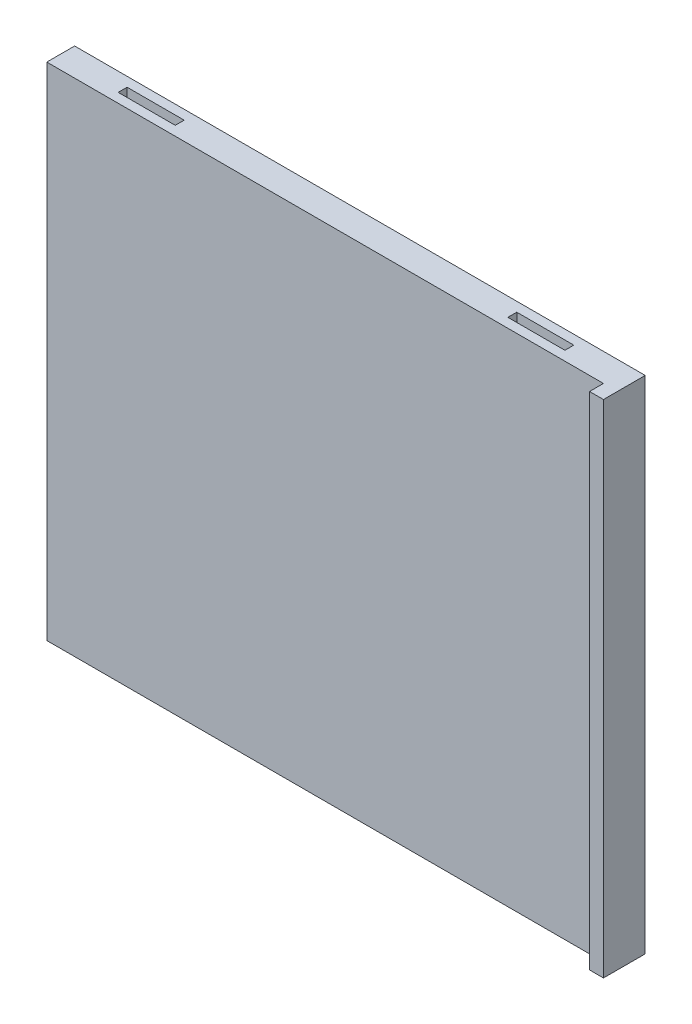
ISO-10303-21;
HEADER;
FILE_DESCRIPTION(('STEP AP214'),'2;1');
FILE_NAME('part.step','',(''),(''),'','','');
FILE_SCHEMA(('AUTOMOTIVE_DESIGN { 1 0 10303 214 1 1 1 1 }'));
ENDSEC;
DATA;
#1=APPLICATION_CONTEXT('core data for automotive mechanical design processes');
#2=APPLICATION_PROTOCOL_DEFINITION('international standard','automotive_design',2000,#1);
#3=PRODUCT_CONTEXT('',#1,'mechanical');
#4=PRODUCT('Part','Part','',(#3));
#5=PRODUCT_RELATED_PRODUCT_CATEGORY('part','',(#4));
#6=PRODUCT_DEFINITION_FORMATION('','',#4);
#7=PRODUCT_DEFINITION_CONTEXT('part definition',#1,'design');
#8=PRODUCT_DEFINITION('design','',#6,#7);
#9=PRODUCT_DEFINITION_SHAPE('','',#8);
#10=(LENGTH_UNIT() NAMED_UNIT(*) SI_UNIT(.MILLI.,.METRE.));
#11=(NAMED_UNIT(*) PLANE_ANGLE_UNIT() SI_UNIT($,.RADIAN.));
#12=(NAMED_UNIT(*) SI_UNIT($,.STERADIAN.) SOLID_ANGLE_UNIT());
#13=UNCERTAINTY_MEASURE_WITH_UNIT(LENGTH_MEASURE(1.E-05),#10,'distance_accuracy_value','');
#14=(GEOMETRIC_REPRESENTATION_CONTEXT(3) GLOBAL_UNCERTAINTY_ASSIGNED_CONTEXT((#13)) GLOBAL_UNIT_ASSIGNED_CONTEXT((#10,
#11,#12)) REPRESENTATION_CONTEXT('',''));
#15=CARTESIAN_POINT('',(0.,0.,0.));
#16=DIRECTION('',(0.,0.,1.));
#17=DIRECTION('',(1.,0.,0.));
#18=AXIS2_PLACEMENT_3D('',#15,#16,#17);
#19=CARTESIAN_POINT('',(102.5,90.,10.));
#20=DIRECTION('',(0.,-1.,0.));
#21=DIRECTION('',(0.,0.,-1.));
#22=AXIS2_PLACEMENT_3D('',#19,#20,#21);
#23=PLANE('',#22);
#24=DIRECTION('',(0.,0.,1.));
#25=VECTOR('',#24,1.);
#26=CARTESIAN_POINT('',(-59.75,90.,3.4));
#27=LINE('',#26,#25);
#28=CARTESIAN_POINT('',(-59.75,90.,3.4));
#29=VERTEX_POINT('',#28);
#30=CARTESIAN_POINT('',(-59.75,90.,6.6));
#31=VERTEX_POINT('',#30);
#32=EDGE_CURVE('E62',#29,#31,#27,.T.);
#33=ORIENTED_EDGE('',*,*,#32,.T.);
#34=DIRECTION('',(-1.,0.,0.));
#35=VECTOR('',#34,1.);
#36=CARTESIAN_POINT('',(-59.75,90.,6.6));
#37=LINE('',#36,#35);
#38=CARTESIAN_POINT('',(-80.25,90.,6.6));
#39=VERTEX_POINT('',#38);
#40=EDGE_CURVE('E281',#31,#39,#37,.T.);
#41=ORIENTED_EDGE('',*,*,#40,.T.);
#42=DIRECTION('',(0.,0.,-1.));
#43=VECTOR('',#42,1.);
#44=CARTESIAN_POINT('',(-80.25,90.,3.4));
#45=LINE('',#44,#43);
#46=CARTESIAN_POINT('',(-80.25,90.,3.4));
#47=VERTEX_POINT('',#46);
#48=EDGE_CURVE('E292',#39,#47,#45,.T.);
#49=ORIENTED_EDGE('',*,*,#48,.T.);
#50=DIRECTION('',(1.,0.,0.));
#51=VECTOR('',#50,1.);
#52=CARTESIAN_POINT('',(-59.75,90.,3.4));
#53=LINE('',#52,#51);
#54=EDGE_CURVE('E288',#47,#29,#53,.T.);
#55=ORIENTED_EDGE('',*,*,#54,.T.);
#56=EDGE_LOOP('',(#33,#41,#49,#55));
#57=FACE_BOUND('',#56,.T.);
#58=DIRECTION('',(-1.,0.,0.));
#59=VECTOR('',#58,1.);
#60=CARTESIAN_POINT('',(102.5,90.,0.));
#61=LINE('',#60,#59);
#62=CARTESIAN_POINT('',(102.5,90.,0.));
#63=VERTEX_POINT('',#62);
#64=CARTESIAN_POINT('',(-102.5,90.,0.));
#65=VERTEX_POINT('',#64);
#66=EDGE_CURVE('E448',#63,#65,#61,.T.);
#67=ORIENTED_EDGE('',*,*,#66,.T.);
#68=DIRECTION('',(0.,0.,-1.));
#69=VECTOR('',#68,1.);
#70=CARTESIAN_POINT('',(-102.5,90.,10.));
#71=LINE('',#70,#69);
#72=CARTESIAN_POINT('',(-102.5,90.,10.));
#73=VERTEX_POINT('',#72);
#74=EDGE_CURVE('E11',#73,#65,#71,.T.);
#75=ORIENTED_EDGE('',*,*,#74,.F.);
#76=DIRECTION('',(-1.,0.,0.));
#77=VECTOR('',#76,1.);
#78=CARTESIAN_POINT('',(102.5,90.,10.));
#79=LINE('',#78,#77);
#80=CARTESIAN_POINT('',(97.5,90.,10.));
#81=VERTEX_POINT('',#80);
#82=EDGE_CURVE('E452',#81,#73,#79,.T.);
#83=ORIENTED_EDGE('',*,*,#82,.F.);
#84=DIRECTION('',(0.,0.,-1.));
#85=VECTOR('',#84,1.);
#86=CARTESIAN_POINT('',(97.5,90.,15.));
#87=LINE('',#86,#85);
#88=CARTESIAN_POINT('',(97.5,90.,15.));
#89=VERTEX_POINT('',#88);
#90=EDGE_CURVE('E450',#89,#81,#87,.T.);
#91=ORIENTED_EDGE('',*,*,#90,.F.);
#92=DIRECTION('',(-1.,0.,0.));
#93=VECTOR('',#92,1.);
#94=CARTESIAN_POINT('',(97.5,90.,15.));
#95=LINE('',#94,#93);
#96=CARTESIAN_POINT('',(102.5,90.,15.));
#97=VERTEX_POINT('',#96);
#98=EDGE_CURVE('E431',#97,#89,#95,.T.);
#99=ORIENTED_EDGE('',*,*,#98,.F.);
#100=DIRECTION('',(0.,0.,-1.));
#101=VECTOR('',#100,1.);
#102=CARTESIAN_POINT('',(102.5,90.,10.));
#103=LINE('',#102,#101);
#104=EDGE_CURVE('E457',#97,#63,#103,.T.);
#105=ORIENTED_EDGE('',*,*,#104,.T.);
#106=EDGE_LOOP('',(#67,#75,#83,#91,#99,#105));
#107=FACE_BOUND('',#106,.T.);
#108=DIRECTION('',(0.,0.,1.));
#109=VECTOR('',#108,1.);
#110=CARTESIAN_POINT('',(80.25,90.,3.4));
#111=LINE('',#110,#109);
#112=CARTESIAN_POINT('',(80.25,90.,3.4));
#113=VERTEX_POINT('',#112);
#114=CARTESIAN_POINT('',(80.25,90.,6.6));
#115=VERTEX_POINT('',#114);
#116=EDGE_CURVE('E52',#113,#115,#111,.T.);
#117=ORIENTED_EDGE('',*,*,#116,.T.);
#118=DIRECTION('',(-1.,0.,0.));
#119=VECTOR('',#118,1.);
#120=CARTESIAN_POINT('',(59.75,90.,6.6));
#121=LINE('',#120,#119);
#122=CARTESIAN_POINT('',(59.75,90.,6.6));
#123=VERTEX_POINT('',#122);
#124=EDGE_CURVE('E260',#115,#123,#121,.T.);
#125=ORIENTED_EDGE('',*,*,#124,.T.);
#126=DIRECTION('',(0.,0.,-1.));
#127=VECTOR('',#126,1.);
#128=CARTESIAN_POINT('',(59.75,90.,3.4));
#129=LINE('',#128,#127);
#130=CARTESIAN_POINT('',(59.75,90.,3.4));
#131=VERTEX_POINT('',#130);
#132=EDGE_CURVE('E258',#123,#131,#129,.T.);
#133=ORIENTED_EDGE('',*,*,#132,.T.);
#134=DIRECTION('',(1.,0.,0.));
#135=VECTOR('',#134,1.);
#136=CARTESIAN_POINT('',(59.75,90.,3.4));
#137=LINE('',#136,#135);
#138=EDGE_CURVE('E269',#131,#113,#137,.T.);
#139=ORIENTED_EDGE('',*,*,#138,.T.);
#140=EDGE_LOOP('',(#117,#125,#133,#139));
#141=FACE_BOUND('',#140,.T.);
#142=ADVANCED_FACE('F39',(#57,#107,#141),#23,.F.);
#143=CARTESIAN_POINT('',(0.,0.,10.));
#144=DIRECTION('',(0.,0.,-1.));
#145=DIRECTION('',(-1.,0.,0.));
#146=AXIS2_PLACEMENT_3D('',#143,#144,#145);
#147=PLANE('',#146);
#148=DIRECTION('',(0.,-1.,0.));
#149=VECTOR('',#148,1.);
#150=CARTESIAN_POINT('',(97.5,-90.,10.));
#151=LINE('',#150,#149);
#152=CARTESIAN_POINT('',(97.5,-90.,10.));
#153=VERTEX_POINT('',#152);
#154=EDGE_CURVE('E393',#81,#153,#151,.T.);
#155=ORIENTED_EDGE('',*,*,#154,.F.);
#156=ORIENTED_EDGE('',*,*,#82,.T.);
#157=DIRECTION('',(0.,-1.,0.));
#158=VECTOR('',#157,1.);
#159=CARTESIAN_POINT('',(-102.5,-90.,10.));
#160=LINE('',#159,#158);
#161=CARTESIAN_POINT('',(-102.5,-90.,10.));
#162=VERTEX_POINT('',#161);
#163=EDGE_CURVE('E454',#73,#162,#160,.T.);
#164=ORIENTED_EDGE('',*,*,#163,.T.);
#165=DIRECTION('',(1.,0.,0.));
#166=VECTOR('',#165,1.);
#167=CARTESIAN_POINT('',(102.5,-90.,10.));
#168=LINE('',#167,#166);
#169=EDGE_CURVE('E456',#162,#153,#168,.T.);
#170=ORIENTED_EDGE('',*,*,#169,.T.);
#171=EDGE_LOOP('',(#155,#156,#164,#170));
#172=FACE_BOUND('',#171,.T.);
#173=ADVANCED_FACE('F498',(#172),#147,.F.);
#174=CARTESIAN_POINT('',(-102.5,-90.,10.));
#175=DIRECTION('',(1.,0.,0.));
#176=DIRECTION('',(0.,0.,-1.));
#177=AXIS2_PLACEMENT_3D('',#174,#175,#176);
#178=PLANE('',#177);
#179=DIRECTION('',(0.,-1.,0.));
#180=VECTOR('',#179,1.);
#181=CARTESIAN_POINT('',(-102.5,30.,3.25));
#182=LINE('',#181,#180);
#183=CARTESIAN_POINT('',(-102.5,51.,3.25));
#184=VERTEX_POINT('',#183);
#185=CARTESIAN_POINT('',(-102.5,30.,3.25));
#186=VERTEX_POINT('',#185);
#187=EDGE_CURVE('E384',#184,#186,#182,.T.);
#188=ORIENTED_EDGE('',*,*,#187,.F.);
#189=DIRECTION('',(0.,0.,-1.));
#190=VECTOR('',#189,1.);
#191=CARTESIAN_POINT('',(-102.5,51.,3.25));
#192=LINE('',#191,#190);
#193=CARTESIAN_POINT('',(-102.5,51.,6.75));
#194=VERTEX_POINT('',#193);
#195=EDGE_CURVE('E382',#194,#184,#192,.T.);
#196=ORIENTED_EDGE('',*,*,#195,.F.);
#197=DIRECTION('',(0.,1.,0.));
#198=VECTOR('',#197,1.);
#199=CARTESIAN_POINT('',(-102.5,30.,6.75));
#200=LINE('',#199,#198);
#201=CARTESIAN_POINT('',(-102.5,30.,6.75));
#202=VERTEX_POINT('',#201);
#203=EDGE_CURVE('E371',#202,#194,#200,.T.);
#204=ORIENTED_EDGE('',*,*,#203,.F.);
#205=DIRECTION('',(0.,0.,1.));
#206=VECTOR('',#205,1.);
#207=CARTESIAN_POINT('',(-102.5,30.,3.25));
#208=LINE('',#207,#206);
#209=EDGE_CURVE('E390',#186,#202,#208,.T.);
#210=ORIENTED_EDGE('',*,*,#209,.F.);
#211=EDGE_LOOP('',(#188,#196,#204,#210));
#212=FACE_BOUND('',#211,.T.);
#213=DIRECTION('',(0.,-1.,0.));
#214=VECTOR('',#213,1.);
#215=CARTESIAN_POINT('',(-102.5,-30.,3.25));
#216=LINE('',#215,#214);
#217=CARTESIAN_POINT('',(-102.5,-30.,3.25));
#218=VERTEX_POINT('',#217);
#219=CARTESIAN_POINT('',(-102.5,-51.,3.25000000000044));
#220=VERTEX_POINT('',#219);
#221=EDGE_CURVE('E416',#218,#220,#216,.T.);
#222=ORIENTED_EDGE('',*,*,#221,.F.);
#223=DIRECTION('',(0.,0.,-1.));
#224=VECTOR('',#223,1.);
#225=CARTESIAN_POINT('',(-102.5,-30.,3.25));
#226=LINE('',#225,#224);
#227=CARTESIAN_POINT('',(-102.5,-30.,6.75));
#228=VERTEX_POINT('',#227);
#229=EDGE_CURVE('E381',#228,#218,#226,.T.);
#230=ORIENTED_EDGE('',*,*,#229,.F.);
#231=DIRECTION('',(0.,1.,0.));
#232=VECTOR('',#231,1.);
#233=CARTESIAN_POINT('',(-102.5,-30.,6.75));
#234=LINE('',#233,#232);
#235=CARTESIAN_POINT('',(-102.5,-50.9999999999999,6.75000000000044));
#236=VERTEX_POINT('',#235);
#237=EDGE_CURVE('E408',#236,#228,#234,.T.);
#238=ORIENTED_EDGE('',*,*,#237,.F.);
#239=DIRECTION('',(0.,0.,1.));
#240=VECTOR('',#239,1.);
#241=CARTESIAN_POINT('',(-102.5,-51.,3.25000000000044));
#242=LINE('',#241,#240);
#243=EDGE_CURVE('E412',#220,#236,#242,.T.);
#244=ORIENTED_EDGE('',*,*,#243,.F.);
#245=EDGE_LOOP('',(#222,#230,#238,#244));
#246=FACE_BOUND('',#245,.T.);
#247=DIRECTION('',(0.,-1.,0.));
#248=VECTOR('',#247,1.);
#249=CARTESIAN_POINT('',(-102.5,-90.,0.));
#250=LINE('',#249,#248);
#251=CARTESIAN_POINT('',(-102.5,-90.,0.));
#252=VERTEX_POINT('',#251);
#253=EDGE_CURVE('E464',#65,#252,#250,.T.);
#254=ORIENTED_EDGE('',*,*,#253,.T.);
#255=DIRECTION('',(0.,0.,-1.));
#256=VECTOR('',#255,1.);
#257=CARTESIAN_POINT('',(-102.5,-90.,10.));
#258=LINE('',#257,#256);
#259=EDGE_CURVE('E46',#162,#252,#258,.T.);
#260=ORIENTED_EDGE('',*,*,#259,.F.);
#261=ORIENTED_EDGE('',*,*,#163,.F.);
#262=ORIENTED_EDGE('',*,*,#74,.T.);
#263=EDGE_LOOP('',(#254,#260,#261,#262));
#264=FACE_BOUND('',#263,.T.);
#265=ADVANCED_FACE('F497',(#212,#246,#264),#178,.F.);
#266=CARTESIAN_POINT('',(102.5,-90.,10.));
#267=DIRECTION('',(0.,1.,0.));
#268=DIRECTION('',(0.,0.,1.));
#269=AXIS2_PLACEMENT_3D('',#266,#267,#268);
#270=PLANE('',#269);
#271=DIRECTION('',(-1.,0.,0.));
#272=VECTOR('',#271,1.);
#273=CARTESIAN_POINT('',(59.75,-90.,6.6));
#274=LINE('',#273,#272);
#275=CARTESIAN_POINT('',(80.25,-90.,6.6));
#276=VERTEX_POINT('',#275);
#277=CARTESIAN_POINT('',(59.75,-90.,6.6));
#278=VERTEX_POINT('',#277);
#279=EDGE_CURVE('E316',#276,#278,#274,.T.);
#280=ORIENTED_EDGE('',*,*,#279,.F.);
#281=DIRECTION('',(0.,0.,1.));
#282=VECTOR('',#281,1.);
#283=CARTESIAN_POINT('',(80.25,-90.,3.4));
#284=LINE('',#283,#282);
#285=CARTESIAN_POINT('',(80.25,-90.,3.4));
#286=VERTEX_POINT('',#285);
#287=EDGE_CURVE('E320',#286,#276,#284,.T.);
#288=ORIENTED_EDGE('',*,*,#287,.F.);
#289=DIRECTION('',(1.,0.,0.));
#290=VECTOR('',#289,1.);
#291=CARTESIAN_POINT('',(59.75,-90.,3.4));
#292=LINE('',#291,#290);
#293=CARTESIAN_POINT('',(59.75,-90.,3.4));
#294=VERTEX_POINT('',#293);
#295=EDGE_CURVE('E310',#294,#286,#292,.T.);
#296=ORIENTED_EDGE('',*,*,#295,.F.);
#297=DIRECTION('',(0.,0.,-1.));
#298=VECTOR('',#297,1.);
#299=CARTESIAN_POINT('',(59.75,-90.,3.4));
#300=LINE('',#299,#298);
#301=EDGE_CURVE('E324',#278,#294,#300,.T.);
#302=ORIENTED_EDGE('',*,*,#301,.F.);
#303=EDGE_LOOP('',(#280,#288,#296,#302));
#304=FACE_BOUND('',#303,.T.);
#305=DIRECTION('',(-1.,0.,0.));
#306=VECTOR('',#305,1.);
#307=CARTESIAN_POINT('',(-59.75,-90.,6.6));
#308=LINE('',#307,#306);
#309=CARTESIAN_POINT('',(-59.75,-90.,6.6));
#310=VERTEX_POINT('',#309);
#311=CARTESIAN_POINT('',(-80.25,-90.,6.6));
#312=VERTEX_POINT('',#311);
#313=EDGE_CURVE('E355',#310,#312,#308,.T.);
#314=ORIENTED_EDGE('',*,*,#313,.F.);
#315=DIRECTION('',(0.,0.,1.));
#316=VECTOR('',#315,1.);
#317=CARTESIAN_POINT('',(-59.75,-90.,3.4));
#318=LINE('',#317,#316);
#319=CARTESIAN_POINT('',(-59.75,-90.,3.4));
#320=VERTEX_POINT('',#319);
#321=EDGE_CURVE('E318',#320,#310,#318,.T.);
#322=ORIENTED_EDGE('',*,*,#321,.F.);
#323=DIRECTION('',(1.,0.,0.));
#324=VECTOR('',#323,1.);
#325=CARTESIAN_POINT('',(-59.75,-90.,3.4));
#326=LINE('',#325,#324);
#327=CARTESIAN_POINT('',(-80.25,-90.,3.4));
#328=VERTEX_POINT('',#327);
#329=EDGE_CURVE('E346',#328,#320,#326,.T.);
#330=ORIENTED_EDGE('',*,*,#329,.F.);
#331=DIRECTION('',(0.,0.,-1.));
#332=VECTOR('',#331,1.);
#333=CARTESIAN_POINT('',(-80.25,-90.,3.4));
#334=LINE('',#333,#332);
#335=EDGE_CURVE('E348',#312,#328,#334,.T.);
#336=ORIENTED_EDGE('',*,*,#335,.F.);
#337=EDGE_LOOP('',(#314,#322,#330,#336));
#338=FACE_BOUND('',#337,.T.);
#339=DIRECTION('',(1.,0.,0.));
#340=VECTOR('',#339,1.);
#341=CARTESIAN_POINT('',(102.5,-90.,0.));
#342=LINE('',#341,#340);
#343=CARTESIAN_POINT('',(102.5,-90.,0.));
#344=VERTEX_POINT('',#343);
#345=EDGE_CURVE('E465',#252,#344,#342,.T.);
#346=ORIENTED_EDGE('',*,*,#345,.T.);
#347=DIRECTION('',(0.,0.,-1.));
#348=VECTOR('',#347,1.);
#349=CARTESIAN_POINT('',(102.5,-90.,10.));
#350=LINE('',#349,#348);
#351=CARTESIAN_POINT('',(102.5,-90.,15.));
#352=VERTEX_POINT('',#351);
#353=EDGE_CURVE('E466',#352,#344,#350,.T.);
#354=ORIENTED_EDGE('',*,*,#353,.F.);
#355=DIRECTION('',(1.,0.,0.));
#356=VECTOR('',#355,1.);
#357=CARTESIAN_POINT('',(102.5,-90.,15.));
#358=LINE('',#357,#356);
#359=CARTESIAN_POINT('',(97.5,-90.,15.));
#360=VERTEX_POINT('',#359);
#361=EDGE_CURVE('E436',#360,#352,#358,.T.);
#362=ORIENTED_EDGE('',*,*,#361,.F.);
#363=DIRECTION('',(0.,0.,-1.));
#364=VECTOR('',#363,1.);
#365=CARTESIAN_POINT('',(97.5,-90.,15.));
#366=LINE('',#365,#364);
#367=EDGE_CURVE('E445',#360,#153,#366,.T.);
#368=ORIENTED_EDGE('',*,*,#367,.T.);
#369=ORIENTED_EDGE('',*,*,#169,.F.);
#370=ORIENTED_EDGE('',*,*,#259,.T.);
#371=EDGE_LOOP('',(#346,#354,#362,#368,#369,#370));
#372=FACE_BOUND('',#371,.T.);
#373=ADVANCED_FACE('F473',(#304,#338,#372),#270,.F.);
#374=CARTESIAN_POINT('',(102.5,-90.,10.));
#375=DIRECTION('',(-1.,0.,0.));
#376=DIRECTION('',(0.,0.,1.));
#377=AXIS2_PLACEMENT_3D('',#374,#375,#376);
#378=PLANE('',#377);
#379=DIRECTION('',(0.,1.,0.));
#380=VECTOR('',#379,1.);
#381=CARTESIAN_POINT('',(102.5,-90.,0.));
#382=LINE('',#381,#380);
#383=EDGE_CURVE('E451',#344,#63,#382,.T.);
#384=ORIENTED_EDGE('',*,*,#383,.T.);
#385=ORIENTED_EDGE('',*,*,#104,.F.);
#386=DIRECTION('',(0.,1.,0.));
#387=VECTOR('',#386,1.);
#388=CARTESIAN_POINT('',(102.5,90.,15.));
#389=LINE('',#388,#387);
#390=EDGE_CURVE('E437',#352,#97,#389,.T.);
#391=ORIENTED_EDGE('',*,*,#390,.F.);
#392=ORIENTED_EDGE('',*,*,#353,.T.);
#393=EDGE_LOOP('',(#384,#385,#391,#392));
#394=FACE_BOUND('',#393,.T.);
#395=ADVANCED_FACE('F485',(#394),#378,.F.);
#396=CARTESIAN_POINT('',(0.,0.,0.));
#397=DIRECTION('',(0.,0.,-1.));
#398=DIRECTION('',(-1.,0.,0.));
#399=AXIS2_PLACEMENT_3D('',#396,#397,#398);
#400=PLANE('',#399);
#401=ORIENTED_EDGE('',*,*,#66,.F.);
#402=ORIENTED_EDGE('',*,*,#383,.F.);
#403=ORIENTED_EDGE('',*,*,#345,.F.);
#404=ORIENTED_EDGE('',*,*,#253,.F.);
#405=EDGE_LOOP('',(#401,#402,#403,#404));
#406=FACE_BOUND('',#405,.T.);
#407=ADVANCED_FACE('F484',(#406),#400,.T.);
#408=CARTESIAN_POINT('',(97.5,-90.,15.));
#409=DIRECTION('',(1.,0.,0.));
#410=DIRECTION('',(0.,1.,0.));
#411=AXIS2_PLACEMENT_3D('',#408,#409,#410);
#412=PLANE('',#411);
#413=ORIENTED_EDGE('',*,*,#154,.T.);
#414=ORIENTED_EDGE('',*,*,#367,.F.);
#415=DIRECTION('',(0.,-1.,0.));
#416=VECTOR('',#415,1.);
#417=CARTESIAN_POINT('',(97.5,-90.,15.));
#418=LINE('',#417,#416);
#419=EDGE_CURVE('E432',#89,#360,#418,.T.);
#420=ORIENTED_EDGE('',*,*,#419,.F.);
#421=ORIENTED_EDGE('',*,*,#90,.T.);
#422=EDGE_LOOP('',(#413,#414,#420,#421));
#423=FACE_BOUND('',#422,.T.);
#424=ADVANCED_FACE('F496',(#423),#412,.F.);
#425=CARTESIAN_POINT('',(0.,0.,15.));
#426=DIRECTION('',(0.,0.,-1.));
#427=DIRECTION('',(-1.,0.,0.));
#428=AXIS2_PLACEMENT_3D('',#425,#426,#427);
#429=PLANE('',#428);
#430=ORIENTED_EDGE('',*,*,#98,.T.);
#431=ORIENTED_EDGE('',*,*,#419,.T.);
#432=ORIENTED_EDGE('',*,*,#361,.T.);
#433=ORIENTED_EDGE('',*,*,#390,.T.);
#434=EDGE_LOOP('',(#430,#431,#432,#433));
#435=FACE_BOUND('',#434,.T.);
#436=ADVANCED_FACE('F495',(#435),#429,.F.);
#437=CARTESIAN_POINT('',(-92.5,-30.,3.25));
#438=DIRECTION('',(0.,1.,0.));
#439=DIRECTION('',(0.,0.,1.));
#440=AXIS2_PLACEMENT_3D('',#437,#438,#439);
#441=PLANE('',#440);
#442=ORIENTED_EDGE('',*,*,#229,.T.);
#443=DIRECTION('',(-1.,0.,0.));
#444=VECTOR('',#443,1.);
#445=CARTESIAN_POINT('',(-92.5,-30.,3.25));
#446=LINE('',#445,#444);
#447=CARTESIAN_POINT('',(-92.5,-30.,3.25));
#448=VERTEX_POINT('',#447);
#449=EDGE_CURVE('E402',#448,#218,#446,.T.);
#450=ORIENTED_EDGE('',*,*,#449,.F.);
#451=DIRECTION('',(0.,0.,-1.));
#452=VECTOR('',#451,1.);
#453=CARTESIAN_POINT('',(-92.5,-30.,3.25));
#454=LINE('',#453,#452);
#455=CARTESIAN_POINT('',(-92.5,-30.,6.75));
#456=VERTEX_POINT('',#455);
#457=EDGE_CURVE('E413',#456,#448,#454,.T.);
#458=ORIENTED_EDGE('',*,*,#457,.F.);
#459=DIRECTION('',(-1.,0.,0.));
#460=VECTOR('',#459,1.);
#461=CARTESIAN_POINT('',(-92.5,-30.,6.75));
#462=LINE('',#461,#460);
#463=EDGE_CURVE('E329',#456,#228,#462,.T.);
#464=ORIENTED_EDGE('',*,*,#463,.T.);
#465=EDGE_LOOP('',(#442,#450,#458,#464));
#466=FACE_BOUND('',#465,.T.);
#467=ADVANCED_FACE('F610',(#466),#441,.F.);
#468=CARTESIAN_POINT('',(-92.5,-30.,6.75));
#469=DIRECTION('',(0.,0.,1.));
#470=DIRECTION('',(0.,-1.,0.));
#471=AXIS2_PLACEMENT_3D('',#468,#469,#470);
#472=PLANE('',#471);
#473=ORIENTED_EDGE('',*,*,#237,.T.);
#474=ORIENTED_EDGE('',*,*,#463,.F.);
#475=DIRECTION('',(0.,1.,0.));
#476=VECTOR('',#475,1.);
#477=CARTESIAN_POINT('',(-92.5,-30.,6.75));
#478=LINE('',#477,#476);
#479=CARTESIAN_POINT('',(-92.5,-50.9999999999999,6.75000000000044));
#480=VERTEX_POINT('',#479);
#481=EDGE_CURVE('E404',#480,#456,#478,.T.);
#482=ORIENTED_EDGE('',*,*,#481,.F.);
#483=DIRECTION('',(-1.,0.,0.));
#484=VECTOR('',#483,1.);
#485=CARTESIAN_POINT('',(-92.5,-50.9999999999999,6.75000000000044));
#486=LINE('',#485,#484);
#487=EDGE_CURVE('E410',#480,#236,#486,.T.);
#488=ORIENTED_EDGE('',*,*,#487,.T.);
#489=EDGE_LOOP('',(#473,#474,#482,#488));
#490=FACE_BOUND('',#489,.T.);
#491=ADVANCED_FACE('F608',(#490),#472,.F.);
#492=CARTESIAN_POINT('',(-92.5,-51.,3.25000000000044));
#493=DIRECTION('',(0.,-1.,0.));
#494=DIRECTION('',(0.,0.,-1.));
#495=AXIS2_PLACEMENT_3D('',#492,#493,#494);
#496=PLANE('',#495);
#497=ORIENTED_EDGE('',*,*,#243,.T.);
#498=ORIENTED_EDGE('',*,*,#487,.F.);
#499=DIRECTION('',(0.,0.,1.));
#500=VECTOR('',#499,1.);
#501=CARTESIAN_POINT('',(-92.5,-51.,3.25000000000044));
#502=LINE('',#501,#500);
#503=CARTESIAN_POINT('',(-92.5,-51.,3.25000000000044));
#504=VERTEX_POINT('',#503);
#505=EDGE_CURVE('E421',#504,#480,#502,.T.);
#506=ORIENTED_EDGE('',*,*,#505,.F.);
#507=DIRECTION('',(-1.,0.,0.));
#508=VECTOR('',#507,1.);
#509=CARTESIAN_POINT('',(-92.5,-51.,3.25000000000044));
#510=LINE('',#509,#508);
#511=EDGE_CURVE('E403',#504,#220,#510,.T.);
#512=ORIENTED_EDGE('',*,*,#511,.T.);
#513=EDGE_LOOP('',(#497,#498,#506,#512));
#514=FACE_BOUND('',#513,.T.);
#515=ADVANCED_FACE('F613',(#514),#496,.F.);
#516=CARTESIAN_POINT('',(-92.5,-30.,3.25));
#517=DIRECTION('',(0.,0.,-1.));
#518=DIRECTION('',(0.,1.,0.));
#519=AXIS2_PLACEMENT_3D('',#516,#517,#518);
#520=PLANE('',#519);
#521=ORIENTED_EDGE('',*,*,#221,.T.);
#522=ORIENTED_EDGE('',*,*,#511,.F.);
#523=DIRECTION('',(0.,-1.,0.));
#524=VECTOR('',#523,1.);
#525=CARTESIAN_POINT('',(-92.5,-30.,3.25));
#526=LINE('',#525,#524);
#527=EDGE_CURVE('E428',#448,#504,#526,.T.);
#528=ORIENTED_EDGE('',*,*,#527,.F.);
#529=ORIENTED_EDGE('',*,*,#449,.T.);
#530=EDGE_LOOP('',(#521,#522,#528,#529));
#531=FACE_BOUND('',#530,.T.);
#532=ADVANCED_FACE('F614',(#531),#520,.F.);
#533=CARTESIAN_POINT('',(-92.5,0.,0.));
#534=DIRECTION('',(1.,0.,0.));
#535=DIRECTION('',(0.,0.,-1.));
#536=AXIS2_PLACEMENT_3D('',#533,#534,#535);
#537=PLANE('',#536);
#538=ORIENTED_EDGE('',*,*,#457,.T.);
#539=ORIENTED_EDGE('',*,*,#527,.T.);
#540=ORIENTED_EDGE('',*,*,#505,.T.);
#541=ORIENTED_EDGE('',*,*,#481,.T.);
#542=EDGE_LOOP('',(#538,#539,#540,#541));
#543=FACE_BOUND('',#542,.T.);
#544=ADVANCED_FACE('F603',(#543),#537,.F.);
#545=CARTESIAN_POINT('',(-92.5,51.,3.25));
#546=DIRECTION('',(0.,1.,0.));
#547=DIRECTION('',(0.,0.,1.));
#548=AXIS2_PLACEMENT_3D('',#545,#546,#547);
#549=PLANE('',#548);
#550=ORIENTED_EDGE('',*,*,#195,.T.);
#551=DIRECTION('',(-1.,0.,0.));
#552=VECTOR('',#551,1.);
#553=CARTESIAN_POINT('',(-92.5,51.,3.25));
#554=LINE('',#553,#552);
#555=CARTESIAN_POINT('',(-92.5,51.,3.25));
#556=VERTEX_POINT('',#555);
#557=EDGE_CURVE('E379',#556,#184,#554,.T.);
#558=ORIENTED_EDGE('',*,*,#557,.F.);
#559=DIRECTION('',(0.,0.,-1.));
#560=VECTOR('',#559,1.);
#561=CARTESIAN_POINT('',(-92.5,51.,3.25));
#562=LINE('',#561,#560);
#563=CARTESIAN_POINT('',(-92.5,51.,6.75));
#564=VERTEX_POINT('',#563);
#565=EDGE_CURVE('E370',#564,#556,#562,.T.);
#566=ORIENTED_EDGE('',*,*,#565,.F.);
#567=DIRECTION('',(-1.,0.,0.));
#568=VECTOR('',#567,1.);
#569=CARTESIAN_POINT('',(-92.5,51.,6.75));
#570=LINE('',#569,#568);
#571=EDGE_CURVE('E395',#564,#194,#570,.T.);
#572=ORIENTED_EDGE('',*,*,#571,.T.);
#573=EDGE_LOOP('',(#550,#558,#566,#572));
#574=FACE_BOUND('',#573,.T.);
#575=ADVANCED_FACE('F592',(#574),#549,.F.);
#576=CARTESIAN_POINT('',(-92.5,30.,6.75));
#577=DIRECTION('',(0.,0.,1.));
#578=DIRECTION('',(0.,-1.,0.));
#579=AXIS2_PLACEMENT_3D('',#576,#577,#578);
#580=PLANE('',#579);
#581=ORIENTED_EDGE('',*,*,#203,.T.);
#582=ORIENTED_EDGE('',*,*,#571,.F.);
#583=DIRECTION('',(0.,1.,0.));
#584=VECTOR('',#583,1.);
#585=CARTESIAN_POINT('',(-92.5,30.,6.75));
#586=LINE('',#585,#584);
#587=CARTESIAN_POINT('',(-92.5,30.,6.75));
#588=VERTEX_POINT('',#587);
#589=EDGE_CURVE('E380',#588,#564,#586,.T.);
#590=ORIENTED_EDGE('',*,*,#589,.F.);
#591=DIRECTION('',(-1.,0.,0.));
#592=VECTOR('',#591,1.);
#593=CARTESIAN_POINT('',(-92.5,30.,6.75));
#594=LINE('',#593,#592);
#595=EDGE_CURVE('E394',#588,#202,#594,.T.);
#596=ORIENTED_EDGE('',*,*,#595,.T.);
#597=EDGE_LOOP('',(#581,#582,#590,#596));
#598=FACE_BOUND('',#597,.T.);
#599=ADVANCED_FACE('F594',(#598),#580,.F.);
#600=CARTESIAN_POINT('',(-92.5,30.,3.25));
#601=DIRECTION('',(0.,-1.,0.));
#602=DIRECTION('',(0.,0.,-1.));
#603=AXIS2_PLACEMENT_3D('',#600,#601,#602);
#604=PLANE('',#603);
#605=ORIENTED_EDGE('',*,*,#209,.T.);
#606=ORIENTED_EDGE('',*,*,#595,.F.);
#607=DIRECTION('',(0.,0.,1.));
#608=VECTOR('',#607,1.);
#609=CARTESIAN_POINT('',(-92.5,30.,3.25));
#610=LINE('',#609,#608);
#611=CARTESIAN_POINT('',(-92.5,30.,3.25));
#612=VERTEX_POINT('',#611);
#613=EDGE_CURVE('E372',#612,#588,#610,.T.);
#614=ORIENTED_EDGE('',*,*,#613,.F.);
#615=DIRECTION('',(-1.,0.,0.));
#616=VECTOR('',#615,1.);
#617=CARTESIAN_POINT('',(-92.5,30.,3.25));
#618=LINE('',#617,#616);
#619=EDGE_CURVE('E396',#612,#186,#618,.T.);
#620=ORIENTED_EDGE('',*,*,#619,.T.);
#621=EDGE_LOOP('',(#605,#606,#614,#620));
#622=FACE_BOUND('',#621,.T.);
#623=ADVANCED_FACE('F593',(#622),#604,.F.);
#624=CARTESIAN_POINT('',(-92.5,30.,3.25));
#625=DIRECTION('',(0.,0.,-1.));
#626=DIRECTION('',(0.,1.,0.));
#627=AXIS2_PLACEMENT_3D('',#624,#625,#626);
#628=PLANE('',#627);
#629=ORIENTED_EDGE('',*,*,#187,.T.);
#630=ORIENTED_EDGE('',*,*,#619,.F.);
#631=DIRECTION('',(0.,-1.,0.));
#632=VECTOR('',#631,1.);
#633=CARTESIAN_POINT('',(-92.5,30.,3.25));
#634=LINE('',#633,#632);
#635=EDGE_CURVE('E369',#556,#612,#634,.T.);
#636=ORIENTED_EDGE('',*,*,#635,.F.);
#637=ORIENTED_EDGE('',*,*,#557,.T.);
#638=EDGE_LOOP('',(#629,#630,#636,#637));
#639=FACE_BOUND('',#638,.T.);
#640=ADVANCED_FACE('F588',(#639),#628,.F.);
#641=CARTESIAN_POINT('',(-92.5,0.,0.));
#642=DIRECTION('',(-1.,0.,0.));
#643=DIRECTION('',(0.,0.,1.));
#644=AXIS2_PLACEMENT_3D('',#641,#642,#643);
#645=PLANE('',#644);
#646=ORIENTED_EDGE('',*,*,#565,.T.);
#647=ORIENTED_EDGE('',*,*,#635,.T.);
#648=ORIENTED_EDGE('',*,*,#613,.T.);
#649=ORIENTED_EDGE('',*,*,#589,.T.);
#650=EDGE_LOOP('',(#646,#647,#648,#649));
#651=FACE_BOUND('',#650,.T.);
#652=ADVANCED_FACE('F571',(#651),#645,.T.);
#653=CARTESIAN_POINT('',(-59.75,-80.,3.4));
#654=DIRECTION('',(1.,0.,0.));
#655=DIRECTION('',(0.,0.,-1.));
#656=AXIS2_PLACEMENT_3D('',#653,#654,#655);
#657=PLANE('',#656);
#658=ORIENTED_EDGE('',*,*,#321,.T.);
#659=DIRECTION('',(0.,-1.,0.));
#660=VECTOR('',#659,1.);
#661=CARTESIAN_POINT('',(-59.75,-80.,6.6));
#662=LINE('',#661,#660);
#663=CARTESIAN_POINT('',(-59.75,-80.,6.6));
#664=VERTEX_POINT('',#663);
#665=EDGE_CURVE('E340',#664,#310,#662,.T.);
#666=ORIENTED_EDGE('',*,*,#665,.F.);
#667=DIRECTION('',(0.,0.,1.));
#668=VECTOR('',#667,1.);
#669=CARTESIAN_POINT('',(-59.75,-80.,3.4));
#670=LINE('',#669,#668);
#671=CARTESIAN_POINT('',(-59.75,-80.,3.4));
#672=VERTEX_POINT('',#671);
#673=EDGE_CURVE('E349',#672,#664,#670,.T.);
#674=ORIENTED_EDGE('',*,*,#673,.F.);
#675=DIRECTION('',(0.,-1.,0.));
#676=VECTOR('',#675,1.);
#677=CARTESIAN_POINT('',(-59.75,-80.,3.4));
#678=LINE('',#677,#676);
#679=EDGE_CURVE('E271',#672,#320,#678,.T.);
#680=ORIENTED_EDGE('',*,*,#679,.T.);
#681=EDGE_LOOP('',(#658,#666,#674,#680));
#682=FACE_BOUND('',#681,.T.);
#683=ADVANCED_FACE('F570',(#682),#657,.F.);
#684=CARTESIAN_POINT('',(-59.75,-80.,3.4));
#685=DIRECTION('',(0.,0.,-1.));
#686=DIRECTION('',(-1.,0.,0.));
#687=AXIS2_PLACEMENT_3D('',#684,#685,#686);
#688=PLANE('',#687);
#689=ORIENTED_EDGE('',*,*,#329,.T.);
#690=ORIENTED_EDGE('',*,*,#679,.F.);
#691=DIRECTION('',(1.,0.,0.));
#692=VECTOR('',#691,1.);
#693=CARTESIAN_POINT('',(-59.75,-80.,3.4));
#694=LINE('',#693,#692);
#695=CARTESIAN_POINT('',(-80.25,-80.,3.4));
#696=VERTEX_POINT('',#695);
#697=EDGE_CURVE('E338',#696,#672,#694,.T.);
#698=ORIENTED_EDGE('',*,*,#697,.F.);
#699=DIRECTION('',(0.,-1.,0.));
#700=VECTOR('',#699,1.);
#701=CARTESIAN_POINT('',(-80.25,-80.,3.4));
#702=LINE('',#701,#700);
#703=EDGE_CURVE('E344',#696,#328,#702,.T.);
#704=ORIENTED_EDGE('',*,*,#703,.T.);
#705=EDGE_LOOP('',(#689,#690,#698,#704));
#706=FACE_BOUND('',#705,.T.);
#707=ADVANCED_FACE('F569',(#706),#688,.F.);
#708=CARTESIAN_POINT('',(-80.25,-80.,3.4));
#709=DIRECTION('',(-1.,0.,0.));
#710=DIRECTION('',(0.,0.,1.));
#711=AXIS2_PLACEMENT_3D('',#708,#709,#710);
#712=PLANE('',#711);
#713=ORIENTED_EDGE('',*,*,#335,.T.);
#714=ORIENTED_EDGE('',*,*,#703,.F.);
#715=DIRECTION('',(0.,0.,-1.));
#716=VECTOR('',#715,1.);
#717=CARTESIAN_POINT('',(-80.25,-80.,3.4));
#718=LINE('',#717,#716);
#719=CARTESIAN_POINT('',(-80.25,-80.,6.6));
#720=VERTEX_POINT('',#719);
#721=EDGE_CURVE('E360',#720,#696,#718,.T.);
#722=ORIENTED_EDGE('',*,*,#721,.F.);
#723=DIRECTION('',(0.,-1.,0.));
#724=VECTOR('',#723,1.);
#725=CARTESIAN_POINT('',(-80.25,-80.,6.6));
#726=LINE('',#725,#724);
#727=EDGE_CURVE('E342',#720,#312,#726,.T.);
#728=ORIENTED_EDGE('',*,*,#727,.T.);
#729=EDGE_LOOP('',(#713,#714,#722,#728));
#730=FACE_BOUND('',#729,.T.);
#731=ADVANCED_FACE('F577',(#730),#712,.F.);
#732=CARTESIAN_POINT('',(-59.75,-80.,6.6));
#733=DIRECTION('',(0.,0.,1.));
#734=DIRECTION('',(1.,0.,0.));
#735=AXIS2_PLACEMENT_3D('',#732,#733,#734);
#736=PLANE('',#735);
#737=ORIENTED_EDGE('',*,*,#313,.T.);
#738=ORIENTED_EDGE('',*,*,#727,.F.);
#739=DIRECTION('',(-1.,0.,0.));
#740=VECTOR('',#739,1.);
#741=CARTESIAN_POINT('',(-59.75,-80.,6.6));
#742=LINE('',#741,#740);
#743=EDGE_CURVE('E365',#664,#720,#742,.T.);
#744=ORIENTED_EDGE('',*,*,#743,.F.);
#745=ORIENTED_EDGE('',*,*,#665,.T.);
#746=EDGE_LOOP('',(#737,#738,#744,#745));
#747=FACE_BOUND('',#746,.T.);
#748=ADVANCED_FACE('F572',(#747),#736,.F.);
#749=CARTESIAN_POINT('',(0.,-80.,0.));
#750=DIRECTION('',(0.,-1.,0.));
#751=DIRECTION('',(0.,0.,-1.));
#752=AXIS2_PLACEMENT_3D('',#749,#750,#751);
#753=PLANE('',#752);
#754=ORIENTED_EDGE('',*,*,#673,.T.);
#755=ORIENTED_EDGE('',*,*,#743,.T.);
#756=ORIENTED_EDGE('',*,*,#721,.T.);
#757=ORIENTED_EDGE('',*,*,#697,.T.);
#758=EDGE_LOOP('',(#754,#755,#756,#757));
#759=FACE_BOUND('',#758,.T.);
#760=ADVANCED_FACE('F564',(#759),#753,.T.);
#761=CARTESIAN_POINT('',(80.25,-80.,3.4));
#762=DIRECTION('',(1.,0.,0.));
#763=DIRECTION('',(0.,0.,-1.));
#764=AXIS2_PLACEMENT_3D('',#761,#762,#763);
#765=PLANE('',#764);
#766=ORIENTED_EDGE('',*,*,#287,.T.);
#767=DIRECTION('',(0.,-1.,0.));
#768=VECTOR('',#767,1.);
#769=CARTESIAN_POINT('',(80.25,-80.,6.6));
#770=LINE('',#769,#768);
#771=CARTESIAN_POINT('',(80.25,-80.,6.6));
#772=VERTEX_POINT('',#771);
#773=EDGE_CURVE('E317',#772,#276,#770,.T.);
#774=ORIENTED_EDGE('',*,*,#773,.F.);
#775=DIRECTION('',(0.,0.,1.));
#776=VECTOR('',#775,1.);
#777=CARTESIAN_POINT('',(80.25,-80.,3.4));
#778=LINE('',#777,#776);
#779=CARTESIAN_POINT('',(80.25,-80.,3.4));
#780=VERTEX_POINT('',#779);
#781=EDGE_CURVE('E303',#780,#772,#778,.T.);
#782=ORIENTED_EDGE('',*,*,#781,.F.);
#783=DIRECTION('',(0.,-1.,0.));
#784=VECTOR('',#783,1.);
#785=CARTESIAN_POINT('',(80.25,-80.,3.4));
#786=LINE('',#785,#784);
#787=EDGE_CURVE('E327',#780,#286,#786,.T.);
#788=ORIENTED_EDGE('',*,*,#787,.T.);
#789=EDGE_LOOP('',(#766,#774,#782,#788));
#790=FACE_BOUND('',#789,.T.);
#791=ADVANCED_FACE('F554',(#790),#765,.F.);
#792=CARTESIAN_POINT('',(59.75,-80.,3.4));
#793=DIRECTION('',(0.,0.,-1.));
#794=DIRECTION('',(-1.,0.,0.));
#795=AXIS2_PLACEMENT_3D('',#792,#793,#794);
#796=PLANE('',#795);
#797=ORIENTED_EDGE('',*,*,#295,.T.);
#798=ORIENTED_EDGE('',*,*,#787,.F.);
#799=DIRECTION('',(1.,0.,0.));
#800=VECTOR('',#799,1.);
#801=CARTESIAN_POINT('',(59.75,-80.,3.4));
#802=LINE('',#801,#800);
#803=CARTESIAN_POINT('',(59.75,-80.,3.4));
#804=VERTEX_POINT('',#803);
#805=EDGE_CURVE('E312',#804,#780,#802,.T.);
#806=ORIENTED_EDGE('',*,*,#805,.F.);
#807=DIRECTION('',(0.,-1.,0.));
#808=VECTOR('',#807,1.);
#809=CARTESIAN_POINT('',(59.75,-80.,3.4));
#810=LINE('',#809,#808);
#811=EDGE_CURVE('E334',#804,#294,#810,.T.);
#812=ORIENTED_EDGE('',*,*,#811,.T.);
#813=EDGE_LOOP('',(#797,#798,#806,#812));
#814=FACE_BOUND('',#813,.T.);
#815=ADVANCED_FACE('F553',(#814),#796,.F.);
#816=CARTESIAN_POINT('',(59.75,-80.,3.4));
#817=DIRECTION('',(-1.,0.,0.));
#818=DIRECTION('',(0.,0.,1.));
#819=AXIS2_PLACEMENT_3D('',#816,#817,#818);
#820=PLANE('',#819);
#821=ORIENTED_EDGE('',*,*,#301,.T.);
#822=ORIENTED_EDGE('',*,*,#811,.F.);
#823=DIRECTION('',(0.,0.,-1.));
#824=VECTOR('',#823,1.);
#825=CARTESIAN_POINT('',(59.75,-80.,3.4));
#826=LINE('',#825,#824);
#827=CARTESIAN_POINT('',(59.75,-80.,6.6));
#828=VERTEX_POINT('',#827);
#829=EDGE_CURVE('E309',#828,#804,#826,.T.);
#830=ORIENTED_EDGE('',*,*,#829,.F.);
#831=DIRECTION('',(0.,-1.,0.));
#832=VECTOR('',#831,1.);
#833=CARTESIAN_POINT('',(59.75,-80.,6.6));
#834=LINE('',#833,#832);
#835=EDGE_CURVE('E335',#828,#278,#834,.T.);
#836=ORIENTED_EDGE('',*,*,#835,.T.);
#837=EDGE_LOOP('',(#821,#822,#830,#836));
#838=FACE_BOUND('',#837,.T.);
#839=ADVANCED_FACE('F555',(#838),#820,.F.);
#840=CARTESIAN_POINT('',(59.75,-80.,6.6));
#841=DIRECTION('',(0.,0.,1.));
#842=DIRECTION('',(1.,0.,0.));
#843=AXIS2_PLACEMENT_3D('',#840,#841,#842);
#844=PLANE('',#843);
#845=ORIENTED_EDGE('',*,*,#279,.T.);
#846=ORIENTED_EDGE('',*,*,#835,.F.);
#847=DIRECTION('',(-1.,0.,0.));
#848=VECTOR('',#847,1.);
#849=CARTESIAN_POINT('',(59.75,-80.,6.6));
#850=LINE('',#849,#848);
#851=EDGE_CURVE('E306',#772,#828,#850,.T.);
#852=ORIENTED_EDGE('',*,*,#851,.F.);
#853=ORIENTED_EDGE('',*,*,#773,.T.);
#854=EDGE_LOOP('',(#845,#846,#852,#853));
#855=FACE_BOUND('',#854,.T.);
#856=ADVANCED_FACE('F548',(#855),#844,.F.);
#857=CARTESIAN_POINT('',(0.,-80.,0.));
#858=DIRECTION('',(0.,1.,0.));
#859=DIRECTION('',(0.,0.,1.));
#860=AXIS2_PLACEMENT_3D('',#857,#858,#859);
#861=PLANE('',#860);
#862=ORIENTED_EDGE('',*,*,#781,.T.);
#863=ORIENTED_EDGE('',*,*,#851,.T.);
#864=ORIENTED_EDGE('',*,*,#829,.T.);
#865=ORIENTED_EDGE('',*,*,#805,.T.);
#866=EDGE_LOOP('',(#862,#863,#864,#865));
#867=FACE_BOUND('',#866,.T.);
#868=ADVANCED_FACE('F546',(#867),#861,.F.);
#869=CARTESIAN_POINT('',(-59.75,80.,3.4));
#870=DIRECTION('',(-1.,0.,0.));
#871=DIRECTION('',(0.,0.,1.));
#872=AXIS2_PLACEMENT_3D('',#869,#870,#871);
#873=PLANE('',#872);
#874=ORIENTED_EDGE('',*,*,#32,.F.);
#875=DIRECTION('',(0.,1.,0.));
#876=VECTOR('',#875,1.);
#877=CARTESIAN_POINT('',(-59.75,80.,3.4));
#878=LINE('',#877,#876);
#879=CARTESIAN_POINT('',(-59.75,80.,3.4));
#880=VERTEX_POINT('',#879);
#881=EDGE_CURVE('E286',#880,#29,#878,.T.);
#882=ORIENTED_EDGE('',*,*,#881,.F.);
#883=DIRECTION('',(0.,0.,1.));
#884=VECTOR('',#883,1.);
#885=CARTESIAN_POINT('',(-59.75,80.,3.4));
#886=LINE('',#885,#884);
#887=CARTESIAN_POINT('',(-59.75,80.,6.6));
#888=VERTEX_POINT('',#887);
#889=EDGE_CURVE('E280',#880,#888,#886,.T.);
#890=ORIENTED_EDGE('',*,*,#889,.T.);
#891=DIRECTION('',(0.,1.,0.));
#892=VECTOR('',#891,1.);
#893=CARTESIAN_POINT('',(-59.75,80.,6.6));
#894=LINE('',#893,#892);
#895=EDGE_CURVE('E266',#888,#31,#894,.T.);
#896=ORIENTED_EDGE('',*,*,#895,.T.);
#897=EDGE_LOOP('',(#874,#882,#890,#896));
#898=FACE_BOUND('',#897,.T.);
#899=ADVANCED_FACE('F529',(#898),#873,.T.);
#900=CARTESIAN_POINT('',(-59.75,80.,6.6));
#901=DIRECTION('',(0.,0.,-1.));
#902=DIRECTION('',(-1.,0.,0.));
#903=AXIS2_PLACEMENT_3D('',#900,#901,#902);
#904=PLANE('',#903);
#905=ORIENTED_EDGE('',*,*,#40,.F.);
#906=ORIENTED_EDGE('',*,*,#895,.F.);
#907=DIRECTION('',(-1.,0.,0.));
#908=VECTOR('',#907,1.);
#909=CARTESIAN_POINT('',(-59.75,80.,6.6));
#910=LINE('',#909,#908);
#911=CARTESIAN_POINT('',(-80.25,80.,6.6));
#912=VERTEX_POINT('',#911);
#913=EDGE_CURVE('E284',#888,#912,#910,.T.);
#914=ORIENTED_EDGE('',*,*,#913,.T.);
#915=DIRECTION('',(0.,1.,0.));
#916=VECTOR('',#915,1.);
#917=CARTESIAN_POINT('',(-80.25,80.,6.6));
#918=LINE('',#917,#916);
#919=EDGE_CURVE('E296',#912,#39,#918,.T.);
#920=ORIENTED_EDGE('',*,*,#919,.T.);
#921=EDGE_LOOP('',(#905,#906,#914,#920));
#922=FACE_BOUND('',#921,.T.);
#923=ADVANCED_FACE('F531',(#922),#904,.T.);
#924=CARTESIAN_POINT('',(-80.25,80.,3.4));
#925=DIRECTION('',(1.,0.,0.));
#926=DIRECTION('',(0.,0.,-1.));
#927=AXIS2_PLACEMENT_3D('',#924,#925,#926);
#928=PLANE('',#927);
#929=ORIENTED_EDGE('',*,*,#48,.F.);
#930=ORIENTED_EDGE('',*,*,#919,.F.);
#931=DIRECTION('',(0.,0.,-1.));
#932=VECTOR('',#931,1.);
#933=CARTESIAN_POINT('',(-80.25,80.,3.4));
#934=LINE('',#933,#932);
#935=CARTESIAN_POINT('',(-80.25,80.,3.4));
#936=VERTEX_POINT('',#935);
#937=EDGE_CURVE('E282',#912,#936,#934,.T.);
#938=ORIENTED_EDGE('',*,*,#937,.T.);
#939=DIRECTION('',(0.,1.,0.));
#940=VECTOR('',#939,1.);
#941=CARTESIAN_POINT('',(-80.25,80.,3.4));
#942=LINE('',#941,#940);
#943=EDGE_CURVE('E297',#936,#47,#942,.T.);
#944=ORIENTED_EDGE('',*,*,#943,.T.);
#945=EDGE_LOOP('',(#929,#930,#938,#944));
#946=FACE_BOUND('',#945,.T.);
#947=ADVANCED_FACE('F533',(#946),#928,.T.);
#948=CARTESIAN_POINT('',(-59.75,80.,3.4));
#949=DIRECTION('',(0.,0.,1.));
#950=DIRECTION('',(1.,0.,0.));
#951=AXIS2_PLACEMENT_3D('',#948,#949,#950);
#952=PLANE('',#951);
#953=ORIENTED_EDGE('',*,*,#54,.F.);
#954=ORIENTED_EDGE('',*,*,#943,.F.);
#955=DIRECTION('',(1.,0.,0.));
#956=VECTOR('',#955,1.);
#957=CARTESIAN_POINT('',(-59.75,80.,3.4));
#958=LINE('',#957,#956);
#959=EDGE_CURVE('E278',#936,#880,#958,.T.);
#960=ORIENTED_EDGE('',*,*,#959,.T.);
#961=ORIENTED_EDGE('',*,*,#881,.T.);
#962=EDGE_LOOP('',(#953,#954,#960,#961));
#963=FACE_BOUND('',#962,.T.);
#964=ADVANCED_FACE('F522',(#963),#952,.T.);
#965=CARTESIAN_POINT('',(0.,80.,0.));
#966=DIRECTION('',(0.,1.,0.));
#967=DIRECTION('',(0.,0.,-1.));
#968=AXIS2_PLACEMENT_3D('',#965,#966,#967);
#969=PLANE('',#968);
#970=ORIENTED_EDGE('',*,*,#889,.F.);
#971=ORIENTED_EDGE('',*,*,#959,.F.);
#972=ORIENTED_EDGE('',*,*,#937,.F.);
#973=ORIENTED_EDGE('',*,*,#913,.F.);
#974=EDGE_LOOP('',(#970,#971,#972,#973));
#975=FACE_BOUND('',#974,.T.);
#976=ADVANCED_FACE('F528',(#975),#969,.T.);
#977=CARTESIAN_POINT('',(80.25,80.,3.4));
#978=DIRECTION('',(-1.,0.,0.));
#979=DIRECTION('',(0.,0.,1.));
#980=AXIS2_PLACEMENT_3D('',#977,#978,#979);
#981=PLANE('',#980);
#982=ORIENTED_EDGE('',*,*,#116,.F.);
#983=DIRECTION('',(0.,1.,0.));
#984=VECTOR('',#983,1.);
#985=CARTESIAN_POINT('',(80.25,80.,3.4));
#986=LINE('',#985,#984);
#987=CARTESIAN_POINT('',(80.25,80.,3.4));
#988=VERTEX_POINT('',#987);
#989=EDGE_CURVE('E245',#988,#113,#986,.T.);
#990=ORIENTED_EDGE('',*,*,#989,.F.);
#991=DIRECTION('',(0.,0.,1.));
#992=VECTOR('',#991,1.);
#993=CARTESIAN_POINT('',(80.25,80.,3.4));
#994=LINE('',#993,#992);
#995=CARTESIAN_POINT('',(80.25,80.,6.6));
#996=VERTEX_POINT('',#995);
#997=EDGE_CURVE('E248',#988,#996,#994,.T.);
#998=ORIENTED_EDGE('',*,*,#997,.T.);
#999=DIRECTION('',(0.,1.,0.));
#1000=VECTOR('',#999,1.);
#1001=CARTESIAN_POINT('',(80.25,80.,6.6));
#1002=LINE('',#1001,#1000);
#1003=EDGE_CURVE('E272',#996,#115,#1002,.T.);
#1004=ORIENTED_EDGE('',*,*,#1003,.T.);
#1005=EDGE_LOOP('',(#982,#990,#998,#1004));
#1006=FACE_BOUND('',#1005,.T.);
#1007=ADVANCED_FACE('F255',(#1006),#981,.T.);
#1008=CARTESIAN_POINT('',(59.75,80.,6.6));
#1009=DIRECTION('',(0.,0.,-1.));
#1010=DIRECTION('',(-1.,0.,0.));
#1011=AXIS2_PLACEMENT_3D('',#1008,#1009,#1010);
#1012=PLANE('',#1011);
#1013=ORIENTED_EDGE('',*,*,#124,.F.);
#1014=ORIENTED_EDGE('',*,*,#1003,.F.);
#1015=DIRECTION('',(-1.,0.,0.));
#1016=VECTOR('',#1015,1.);
#1017=CARTESIAN_POINT('',(59.75,80.,6.6));
#1018=LINE('',#1017,#1016);
#1019=CARTESIAN_POINT('',(59.75,80.,6.6));
#1020=VERTEX_POINT('',#1019);
#1021=EDGE_CURVE('E251',#996,#1020,#1018,.T.);
#1022=ORIENTED_EDGE('',*,*,#1021,.T.);
#1023=DIRECTION('',(0.,1.,0.));
#1024=VECTOR('',#1023,1.);
#1025=CARTESIAN_POINT('',(59.75,80.,6.6));
#1026=LINE('',#1025,#1024);
#1027=EDGE_CURVE('E274',#1020,#123,#1026,.T.);
#1028=ORIENTED_EDGE('',*,*,#1027,.T.);
#1029=EDGE_LOOP('',(#1013,#1014,#1022,#1028));
#1030=FACE_BOUND('',#1029,.T.);
#1031=ADVANCED_FACE('F812',(#1030),#1012,.T.);
#1032=CARTESIAN_POINT('',(59.75,80.,3.4));
#1033=DIRECTION('',(1.,0.,0.));
#1034=DIRECTION('',(0.,0.,-1.));
#1035=AXIS2_PLACEMENT_3D('',#1032,#1033,#1034);
#1036=PLANE('',#1035);
#1037=ORIENTED_EDGE('',*,*,#132,.F.);
#1038=ORIENTED_EDGE('',*,*,#1027,.F.);
#1039=DIRECTION('',(0.,0.,-1.));
#1040=VECTOR('',#1039,1.);
#1041=CARTESIAN_POINT('',(59.75,80.,3.4));
#1042=LINE('',#1041,#1040);
#1043=CARTESIAN_POINT('',(59.75,80.,3.4));
#1044=VERTEX_POINT('',#1043);
#1045=EDGE_CURVE('E247',#1020,#1044,#1042,.T.);
#1046=ORIENTED_EDGE('',*,*,#1045,.T.);
#1047=DIRECTION('',(0.,1.,0.));
#1048=VECTOR('',#1047,1.);
#1049=CARTESIAN_POINT('',(59.75,80.,3.4));
#1050=LINE('',#1049,#1048);
#1051=EDGE_CURVE('E242',#1044,#131,#1050,.T.);
#1052=ORIENTED_EDGE('',*,*,#1051,.T.);
#1053=EDGE_LOOP('',(#1037,#1038,#1046,#1052));
#1054=FACE_BOUND('',#1053,.T.);
#1055=ADVANCED_FACE('F821',(#1054),#1036,.T.);
#1056=CARTESIAN_POINT('',(59.75,80.,3.4));
#1057=DIRECTION('',(0.,0.,1.));
#1058=DIRECTION('',(1.,0.,0.));
#1059=AXIS2_PLACEMENT_3D('',#1056,#1057,#1058);
#1060=PLANE('',#1059);
#1061=ORIENTED_EDGE('',*,*,#138,.F.);
#1062=ORIENTED_EDGE('',*,*,#1051,.F.);
#1063=DIRECTION('',(1.,0.,0.));
#1064=VECTOR('',#1063,1.);
#1065=CARTESIAN_POINT('',(59.75,80.,3.4));
#1066=LINE('',#1065,#1064);
#1067=EDGE_CURVE('E237',#1044,#988,#1066,.T.);
#1068=ORIENTED_EDGE('',*,*,#1067,.T.);
#1069=ORIENTED_EDGE('',*,*,#989,.T.);
#1070=EDGE_LOOP('',(#1061,#1062,#1068,#1069));
#1071=FACE_BOUND('',#1070,.T.);
#1072=ADVANCED_FACE('F241',(#1071),#1060,.T.);
#1073=CARTESIAN_POINT('',(0.,80.,0.));
#1074=DIRECTION('',(0.,-1.,0.));
#1075=DIRECTION('',(0.,0.,1.));
#1076=AXIS2_PLACEMENT_3D('',#1073,#1074,#1075);
#1077=PLANE('',#1076);
#1078=ORIENTED_EDGE('',*,*,#997,.F.);
#1079=ORIENTED_EDGE('',*,*,#1067,.F.);
#1080=ORIENTED_EDGE('',*,*,#1045,.F.);
#1081=ORIENTED_EDGE('',*,*,#1021,.F.);
#1082=EDGE_LOOP('',(#1078,#1079,#1080,#1081));
#1083=FACE_BOUND('',#1082,.T.);
#1084=ADVANCED_FACE('F257',(#1083),#1077,.F.);
#1085=CLOSED_SHELL('',(#142,#173,#265,#373,#395,#407,#424,#436,#467,#491,#515,#532,#544,#575,
#599,#623,#640,#652,#683,#707,#731,#748,#760,#791,#815,#839,#856,#868,#899,#923,#947,#964,#976,
#1007,#1031,#1055,#1072,#1084));
#1086=MANIFOLD_SOLID_BREP('B2',#1085);
#1087=ADVANCED_BREP_SHAPE_REPRESENTATION('',(#18,#1086),#14);
#1088=SHAPE_DEFINITION_REPRESENTATION(#9,#1087);
ENDSEC;
END-ISO-10303-21;
